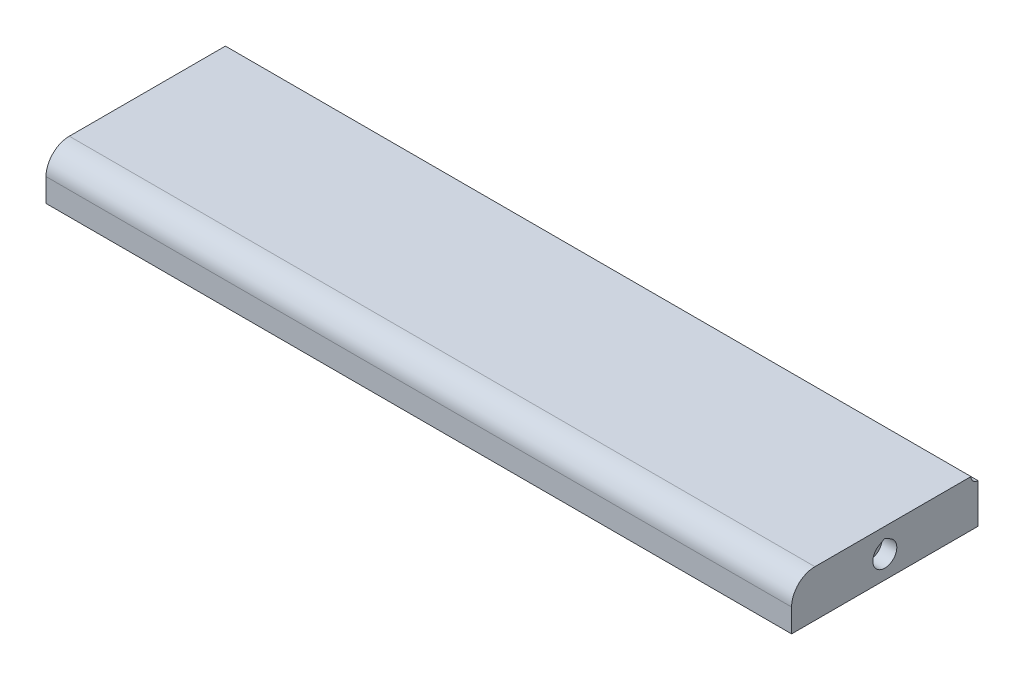
ISO-10303-21;
HEADER;
FILE_DESCRIPTION(('STEP AP214'),'2;1');
FILE_NAME('part.step','',(''),(''),'','','');
FILE_SCHEMA(('AUTOMOTIVE_DESIGN { 1 0 10303 214 1 1 1 1 }'));
ENDSEC;
DATA;
#1=APPLICATION_CONTEXT('core data for automotive mechanical design processes');
#2=APPLICATION_PROTOCOL_DEFINITION('international standard','automotive_design',2000,#1);
#3=PRODUCT_CONTEXT('',#1,'mechanical');
#4=PRODUCT('Part','Part','',(#3));
#5=PRODUCT_RELATED_PRODUCT_CATEGORY('part','',(#4));
#6=PRODUCT_DEFINITION_FORMATION('','',#4);
#7=PRODUCT_DEFINITION_CONTEXT('part definition',#1,'design');
#8=PRODUCT_DEFINITION('design','',#6,#7);
#9=PRODUCT_DEFINITION_SHAPE('','',#8);
#10=(LENGTH_UNIT() NAMED_UNIT(*) SI_UNIT(.MILLI.,.METRE.));
#11=(NAMED_UNIT(*) PLANE_ANGLE_UNIT() SI_UNIT($,.RADIAN.));
#12=(NAMED_UNIT(*) SI_UNIT($,.STERADIAN.) SOLID_ANGLE_UNIT());
#13=UNCERTAINTY_MEASURE_WITH_UNIT(LENGTH_MEASURE(1.E-05),#10,'distance_accuracy_value','');
#14=(GEOMETRIC_REPRESENTATION_CONTEXT(3) GLOBAL_UNCERTAINTY_ASSIGNED_CONTEXT((#13)) GLOBAL_UNIT_ASSIGNED_CONTEXT((#10,
#11,#12)) REPRESENTATION_CONTEXT('',''));
#15=CARTESIAN_POINT('',(0.,0.,0.));
#16=DIRECTION('',(0.,0.,1.));
#17=DIRECTION('',(1.,0.,0.));
#18=AXIS2_PLACEMENT_3D('',#15,#16,#17);
#19=CARTESIAN_POINT('',(-80.,-10.,-20.));
#20=DIRECTION('',(0.,0.,-1.));
#21=DIRECTION('',(-1.,0.,0.));
#22=AXIS2_PLACEMENT_3D('',#19,#20,#21);
#23=PLANE('',#22);
#24=CARTESIAN_POINT('',(40.,-5.94917694316329,-20.));
#25=DIRECTION('',(0.,0.,-1.));
#26=DIRECTION('',(-1.,0.,0.));
#27=AXIS2_PLACEMENT_3D('',#24,#25,#26);
#28=CIRCLE('',#27,2.575);
#29=CARTESIAN_POINT('',(41.2875,-3.71916152841835,-20.));
#30=VERTEX_POINT('',#29);
#31=CARTESIAN_POINT('',(38.7125,-3.71916152841836,-20.));
#32=VERTEX_POINT('',#31);
#33=EDGE_CURVE('E224',#30,#32,#28,.T.);
#34=ORIENTED_EDGE('',*,*,#33,.F.);
#35=DIRECTION('',(-0.866025403784442,0.499999999999995,0.));
#36=VECTOR('',#35,1.);
#37=CARTESIAN_POINT('',(8.71143081780576,15.0886407830611,-20.));
#38=LINE('',#37,#36);
#39=CARTESIAN_POINT('',(40.,-2.97582305683672,-20.));
#40=VERTEX_POINT('',#39);
#41=EDGE_CURVE('E219',#30,#40,#38,.T.);
#42=ORIENTED_EDGE('',*,*,#41,.T.);
#43=DIRECTION('',(-0.866025403784441,-0.499999999999995,0.));
#44=VECTOR('',#43,1.);
#45=CARTESIAN_POINT('',(11.2885691821938,-19.5523753683162,-20.));
#46=LINE('',#45,#44);
#47=EDGE_CURVE('E226',#40,#32,#46,.T.);
#48=ORIENTED_EDGE('',*,*,#47,.T.);
#49=EDGE_LOOP('',(#34,#42,#48));
#50=FACE_BOUND('',#49,.T.);
#51=DIRECTION('',(-1.,0.,0.));
#52=VECTOR('',#51,1.);
#53=CARTESIAN_POINT('',(81.,-1.5,-20.));
#54=LINE('',#53,#52);
#55=CARTESIAN_POINT('',(80.,-1.5,-20.));
#56=VERTEX_POINT('',#55);
#57=CARTESIAN_POINT('',(-80.,-1.5,-20.));
#58=VERTEX_POINT('',#57);
#59=EDGE_CURVE('E266',#56,#58,#54,.T.);
#60=ORIENTED_EDGE('',*,*,#59,.F.);
#61=DIRECTION('',(0.,1.,0.));
#62=VECTOR('',#61,1.);
#63=CARTESIAN_POINT('',(80.,-10.,-20.));
#64=LINE('',#63,#62);
#65=CARTESIAN_POINT('',(80.,-10.,-20.));
#66=VERTEX_POINT('',#65);
#67=EDGE_CURVE('E290',#66,#56,#64,.T.);
#68=ORIENTED_EDGE('',*,*,#67,.F.);
#69=DIRECTION('',(-1.,0.,0.));
#70=VECTOR('',#69,1.);
#71=CARTESIAN_POINT('',(-80.,-10.,-20.));
#72=LINE('',#71,#70);
#73=CARTESIAN_POINT('',(-80.,-10.,-20.));
#74=VERTEX_POINT('',#73);
#75=EDGE_CURVE('E279',#66,#74,#72,.T.);
#76=ORIENTED_EDGE('',*,*,#75,.T.);
#77=DIRECTION('',(0.,1.,0.));
#78=VECTOR('',#77,1.);
#79=CARTESIAN_POINT('',(-80.,-10.,-20.));
#80=LINE('',#79,#78);
#81=EDGE_CURVE('E286',#74,#58,#80,.T.);
#82=ORIENTED_EDGE('',*,*,#81,.T.);
#83=EDGE_LOOP('',(#60,#68,#76,#82));
#84=FACE_BOUND('',#83,.T.);
#85=DIRECTION('',(0.86602540378444,0.499999999999998,0.));
#86=VECTOR('',#85,1.);
#87=CARTESIAN_POINT('',(-8.7114308178059,15.0886407830612,-20.));
#88=LINE('',#87,#86);
#89=CARTESIAN_POINT('',(-41.2875,-3.71916152841834,-20.));
#90=VERTEX_POINT('',#89);
#91=CARTESIAN_POINT('',(-40.,-2.97582305683671,-20.));
#92=VERTEX_POINT('',#91);
#93=EDGE_CURVE('E251',#90,#92,#88,.T.);
#94=ORIENTED_EDGE('',*,*,#93,.F.);
#95=CARTESIAN_POINT('',(-40.,-5.94917694316328,-20.));
#96=DIRECTION('',(0.,0.,-1.));
#97=DIRECTION('',(-1.,0.,0.));
#98=AXIS2_PLACEMENT_3D('',#95,#96,#97);
#99=CIRCLE('',#98,2.575);
#100=CARTESIAN_POINT('',(-38.7125,-3.71916152841834,-20.));
#101=VERTEX_POINT('',#100);
#102=EDGE_CURVE('E211',#90,#101,#99,.F.);
#103=ORIENTED_EDGE('',*,*,#102,.T.);
#104=DIRECTION('',(0.86602540378444,-0.499999999999997,0.));
#105=VECTOR('',#104,1.);
#106=CARTESIAN_POINT('',(-11.2885691821939,-19.5523753683162,-20.));
#107=LINE('',#106,#105);
#108=EDGE_CURVE('E242',#92,#101,#107,.T.);
#109=ORIENTED_EDGE('',*,*,#108,.F.);
#110=EDGE_LOOP('',(#94,#103,#109));
#111=FACE_BOUND('',#110,.T.);
#112=ADVANCED_FACE('F39',(#50,#84,#111),#23,.T.);
#113=CARTESIAN_POINT('',(-80.,-10.,20.));
#114=DIRECTION('',(-1.,0.,0.));
#115=DIRECTION('',(0.,0.,1.));
#116=AXIS2_PLACEMENT_3D('',#113,#114,#115);
#117=PLANE('',#116);
#118=CARTESIAN_POINT('',(-80.,-5.19917694316328,0.));
#119=DIRECTION('',(-1.,0.,0.));
#120=DIRECTION('',(0.,0.,1.));
#121=AXIS2_PLACEMENT_3D('',#118,#119,#120);
#122=CIRCLE('',#121,2.575);
#123=CARTESIAN_POINT('',(-80.,-2.96916152841835,-1.28749999999999));
#124=VERTEX_POINT('',#123);
#125=CARTESIAN_POINT('',(-80.,-2.96916152841835,1.28749999999999));
#126=VERTEX_POINT('',#125);
#127=EDGE_CURVE('E62',#124,#126,#122,.T.);
#128=ORIENTED_EDGE('',*,*,#127,.F.);
#129=DIRECTION('',(0.,-0.499999999999997,-0.866025403784441));
#130=VECTOR('',#129,1.);
#131=CARTESIAN_POINT('',(-80.,-1.66936729262754,0.963809655774861));
#132=LINE('',#131,#130);
#133=CARTESIAN_POINT('',(-80.,-2.22582305683672,0.));
#134=VERTEX_POINT('',#133);
#135=EDGE_CURVE('E197',#134,#124,#132,.T.);
#136=ORIENTED_EDGE('',*,*,#135,.F.);
#137=DIRECTION('',(0.,-0.499999999999997,0.866025403784441));
#138=VECTOR('',#137,1.);
#139=CARTESIAN_POINT('',(-80.,-1.66936729262755,-0.963809655774863));
#140=LINE('',#139,#138);
#141=EDGE_CURVE('E204',#134,#126,#140,.T.);
#142=ORIENTED_EDGE('',*,*,#141,.T.);
#143=EDGE_LOOP('',(#128,#136,#142));
#144=FACE_BOUND('',#143,.T.);
#145=DIRECTION('',(0.,1.,0.));
#146=VECTOR('',#145,1.);
#147=CARTESIAN_POINT('',(-80.,-10.,20.));
#148=LINE('',#147,#146);
#149=CARTESIAN_POINT('',(-80.,-10.,20.));
#150=VERTEX_POINT('',#149);
#151=CARTESIAN_POINT('',(-80.,-5.,20.));
#152=VERTEX_POINT('',#151);
#153=EDGE_CURVE('E282',#150,#152,#148,.T.);
#154=ORIENTED_EDGE('',*,*,#153,.T.);
#155=CARTESIAN_POINT('',(-80.,-5.,15.));
#156=DIRECTION('',(-1.,0.,0.));
#157=DIRECTION('',(0.,0.,1.));
#158=AXIS2_PLACEMENT_3D('',#155,#156,#157);
#159=CIRCLE('',#158,5.);
#160=CARTESIAN_POINT('',(-80.,0.,15.));
#161=VERTEX_POINT('',#160);
#162=EDGE_CURVE('E11',#152,#161,#159,.T.);
#163=ORIENTED_EDGE('',*,*,#162,.T.);
#164=DIRECTION('',(0.,0.,1.));
#165=VECTOR('',#164,1.);
#166=CARTESIAN_POINT('',(-80.,0.,20.));
#167=LINE('',#166,#165);
#168=CARTESIAN_POINT('',(-80.,0.,-18.5));
#169=VERTEX_POINT('',#168);
#170=EDGE_CURVE('E268',#169,#161,#167,.T.);
#171=ORIENTED_EDGE('',*,*,#170,.F.);
#172=CARTESIAN_POINT('',(-80.,0.,-20.));
#173=DIRECTION('',(-1.,0.,0.));
#174=DIRECTION('',(0.,0.,1.));
#175=AXIS2_PLACEMENT_3D('',#172,#173,#174);
#176=CIRCLE('',#175,1.5);
#177=EDGE_CURVE('E263',#169,#58,#176,.F.);
#178=ORIENTED_EDGE('',*,*,#177,.T.);
#179=ORIENTED_EDGE('',*,*,#81,.F.);
#180=DIRECTION('',(0.,0.,1.));
#181=VECTOR('',#180,1.);
#182=CARTESIAN_POINT('',(-80.,-10.,20.));
#183=LINE('',#182,#181);
#184=EDGE_CURVE('E269',#74,#150,#183,.T.);
#185=ORIENTED_EDGE('',*,*,#184,.T.);
#186=EDGE_LOOP('',(#154,#163,#171,#178,#179,#185));
#187=FACE_BOUND('',#186,.T.);
#188=ADVANCED_FACE('F311',(#144,#187),#117,.T.);
#189=CARTESIAN_POINT('',(80.,-10.,20.));
#190=DIRECTION('',(1.,0.,0.));
#191=DIRECTION('',(0.,0.,-1.));
#192=AXIS2_PLACEMENT_3D('',#189,#190,#191);
#193=PLANE('',#192);
#194=CARTESIAN_POINT('',(80.,-5.19917694316328,0.));
#195=DIRECTION('',(1.,0.,0.));
#196=DIRECTION('',(0.,0.,-1.));
#197=AXIS2_PLACEMENT_3D('',#194,#195,#196);
#198=CIRCLE('',#197,2.575);
#199=CARTESIAN_POINT('',(80.,-2.96916152841835,1.28749999999999));
#200=VERTEX_POINT('',#199);
#201=CARTESIAN_POINT('',(80.,-2.96916152841835,-1.28749999999999));
#202=VERTEX_POINT('',#201);
#203=EDGE_CURVE('E54',#200,#202,#198,.T.);
#204=ORIENTED_EDGE('',*,*,#203,.F.);
#205=DIRECTION('',(0.,-0.499999999999997,0.866025403784441));
#206=VECTOR('',#205,1.);
#207=CARTESIAN_POINT('',(80.,-1.66936729262754,-0.963809655774861));
#208=LINE('',#207,#206);
#209=CARTESIAN_POINT('',(80.,-2.22582305683672,0.));
#210=VERTEX_POINT('',#209);
#211=EDGE_CURVE('E181',#210,#200,#208,.T.);
#212=ORIENTED_EDGE('',*,*,#211,.F.);
#213=DIRECTION('',(0.,-0.499999999999997,-0.866025403784441));
#214=VECTOR('',#213,1.);
#215=CARTESIAN_POINT('',(80.,-1.66936729262755,0.963809655774863));
#216=LINE('',#215,#214);
#217=EDGE_CURVE('E184',#210,#202,#216,.T.);
#218=ORIENTED_EDGE('',*,*,#217,.T.);
#219=EDGE_LOOP('',(#204,#212,#218));
#220=FACE_BOUND('',#219,.T.);
#221=DIRECTION('',(0.,0.,-1.));
#222=VECTOR('',#221,1.);
#223=CARTESIAN_POINT('',(80.,0.,20.));
#224=LINE('',#223,#222);
#225=CARTESIAN_POINT('',(80.,0.,15.));
#226=VERTEX_POINT('',#225);
#227=CARTESIAN_POINT('',(80.,0.,-18.5));
#228=VERTEX_POINT('',#227);
#229=EDGE_CURVE('E273',#226,#228,#224,.T.);
#230=ORIENTED_EDGE('',*,*,#229,.F.);
#231=CARTESIAN_POINT('',(80.,-5.,15.));
#232=DIRECTION('',(1.,0.,0.));
#233=DIRECTION('',(0.,0.,-1.));
#234=AXIS2_PLACEMENT_3D('',#231,#232,#233);
#235=CIRCLE('',#234,5.);
#236=CARTESIAN_POINT('',(80.,-5.,20.));
#237=VERTEX_POINT('',#236);
#238=EDGE_CURVE('E303',#226,#237,#235,.T.);
#239=ORIENTED_EDGE('',*,*,#238,.T.);
#240=DIRECTION('',(0.,1.,0.));
#241=VECTOR('',#240,1.);
#242=CARTESIAN_POINT('',(80.,-10.,20.));
#243=LINE('',#242,#241);
#244=CARTESIAN_POINT('',(80.,-10.,20.));
#245=VERTEX_POINT('',#244);
#246=EDGE_CURVE('E293',#245,#237,#243,.T.);
#247=ORIENTED_EDGE('',*,*,#246,.F.);
#248=DIRECTION('',(0.,0.,-1.));
#249=VECTOR('',#248,1.);
#250=CARTESIAN_POINT('',(80.,-10.,20.));
#251=LINE('',#250,#249);
#252=EDGE_CURVE('E276',#245,#66,#251,.T.);
#253=ORIENTED_EDGE('',*,*,#252,.T.);
#254=ORIENTED_EDGE('',*,*,#67,.T.);
#255=CARTESIAN_POINT('',(80.,0.,-20.));
#256=DIRECTION('',(1.,0.,0.));
#257=DIRECTION('',(0.,0.,-1.));
#258=AXIS2_PLACEMENT_3D('',#255,#256,#257);
#259=CIRCLE('',#258,1.5);
#260=EDGE_CURVE('E234',#56,#228,#259,.F.);
#261=ORIENTED_EDGE('',*,*,#260,.T.);
#262=EDGE_LOOP('',(#230,#239,#247,#253,#254,#261));
#263=FACE_BOUND('',#262,.T.);
#264=ADVANCED_FACE('F320',(#220,#263),#193,.T.);
#265=CARTESIAN_POINT('',(-80.,-10.,20.));
#266=DIRECTION('',(0.,0.,1.));
#267=DIRECTION('',(1.,0.,0.));
#268=AXIS2_PLACEMENT_3D('',#265,#266,#267);
#269=PLANE('',#268);
#270=ORIENTED_EDGE('',*,*,#246,.T.);
#271=DIRECTION('',(1.,0.,0.));
#272=VECTOR('',#271,1.);
#273=CARTESIAN_POINT('',(-80.,-5.,20.));
#274=LINE('',#273,#272);
#275=EDGE_CURVE('E47',#237,#152,#274,.F.);
#276=ORIENTED_EDGE('',*,*,#275,.T.);
#277=ORIENTED_EDGE('',*,*,#153,.F.);
#278=DIRECTION('',(1.,0.,0.));
#279=VECTOR('',#278,1.);
#280=CARTESIAN_POINT('',(-80.,-10.,20.));
#281=LINE('',#280,#279);
#282=EDGE_CURVE('E272',#150,#245,#281,.T.);
#283=ORIENTED_EDGE('',*,*,#282,.T.);
#284=EDGE_LOOP('',(#270,#276,#277,#283));
#285=FACE_BOUND('',#284,.T.);
#286=ADVANCED_FACE('F306',(#285),#269,.T.);
#287=CARTESIAN_POINT('',(0.,-10.,0.));
#288=DIRECTION('',(0.,-1.,0.));
#289=DIRECTION('',(0.,0.,-1.));
#290=AXIS2_PLACEMENT_3D('',#287,#288,#289);
#291=PLANE('',#290);
#292=ORIENTED_EDGE('',*,*,#184,.F.);
#293=ORIENTED_EDGE('',*,*,#75,.F.);
#294=ORIENTED_EDGE('',*,*,#252,.F.);
#295=ORIENTED_EDGE('',*,*,#282,.F.);
#296=EDGE_LOOP('',(#292,#293,#294,#295));
#297=FACE_BOUND('',#296,.T.);
#298=ADVANCED_FACE('F328',(#297),#291,.T.);
#299=CARTESIAN_POINT('',(0.,0.,0.));
#300=DIRECTION('',(0.,-1.,0.));
#301=DIRECTION('',(0.,0.,-1.));
#302=AXIS2_PLACEMENT_3D('',#299,#300,#301);
#303=PLANE('',#302);
#304=ORIENTED_EDGE('',*,*,#170,.T.);
#305=DIRECTION('',(1.,0.,0.));
#306=VECTOR('',#305,1.);
#307=CARTESIAN_POINT('',(80.,0.,15.));
#308=LINE('',#307,#306);
#309=EDGE_CURVE('E300',#161,#226,#308,.T.);
#310=ORIENTED_EDGE('',*,*,#309,.T.);
#311=ORIENTED_EDGE('',*,*,#229,.T.);
#312=DIRECTION('',(-1.,0.,0.));
#313=VECTOR('',#312,1.);
#314=CARTESIAN_POINT('',(81.,0.,-18.5));
#315=LINE('',#314,#313);
#316=EDGE_CURVE('E289',#228,#169,#315,.T.);
#317=ORIENTED_EDGE('',*,*,#316,.T.);
#318=EDGE_LOOP('',(#304,#310,#311,#317));
#319=FACE_BOUND('',#318,.T.);
#320=ADVANCED_FACE('F317',(#319),#303,.F.);
#321=CARTESIAN_POINT('',(81.,0.,-20.));
#322=DIRECTION('',(-1.,0.,0.));
#323=DIRECTION('',(0.,0.,1.));
#324=AXIS2_PLACEMENT_3D('',#321,#322,#323);
#325=CYLINDRICAL_SURFACE('',#324,1.5);
#326=ORIENTED_EDGE('',*,*,#59,.T.);
#327=ORIENTED_EDGE('',*,*,#177,.F.);
#328=ORIENTED_EDGE('',*,*,#316,.F.);
#329=ORIENTED_EDGE('',*,*,#260,.F.);
#330=EDGE_LOOP('',(#326,#327,#328,#329));
#331=FACE_BOUND('',#330,.T.);
#332=ADVANCED_FACE('F323',(#331),#325,.F.);
#333=CARTESIAN_POINT('',(-40.,-5.94917694316328,-16.85));
#334=DIRECTION('',(0.,0.,-1.));
#335=DIRECTION('',(-1.,0.,0.));
#336=AXIS2_PLACEMENT_3D('',#333,#334,#335);
#337=CYLINDRICAL_SURFACE('',#336,2.575);
#338=ORIENTED_EDGE('',*,*,#102,.F.);
#339=DIRECTION('',(0.,0.,-1.));
#340=VECTOR('',#339,1.);
#341=CARTESIAN_POINT('',(-41.2875,-3.71916152841834,-16.85));
#342=LINE('',#341,#340);
#343=CARTESIAN_POINT('',(-41.2875,-3.71916152841834,-16.85));
#344=VERTEX_POINT('',#343);
#345=EDGE_CURVE('E248',#344,#90,#342,.T.);
#346=ORIENTED_EDGE('',*,*,#345,.F.);
#347=CARTESIAN_POINT('',(-40.,-5.94917694316328,-16.85));
#348=DIRECTION('',(0.,0.,-1.));
#349=DIRECTION('',(-1.,0.,0.));
#350=AXIS2_PLACEMENT_3D('',#347,#348,#349);
#351=CIRCLE('',#350,2.575);
#352=CARTESIAN_POINT('',(-38.7125,-3.71916152841834,-16.85));
#353=VERTEX_POINT('',#352);
#354=EDGE_CURVE('E239',#344,#353,#351,.F.);
#355=ORIENTED_EDGE('',*,*,#354,.T.);
#356=DIRECTION('',(0.,0.,-1.));
#357=VECTOR('',#356,1.);
#358=CARTESIAN_POINT('',(-38.7125,-3.71916152841834,-16.85));
#359=LINE('',#358,#357);
#360=EDGE_CURVE('E227',#353,#101,#359,.T.);
#361=ORIENTED_EDGE('',*,*,#360,.T.);
#362=EDGE_LOOP('',(#338,#346,#355,#361));
#363=FACE_BOUND('',#362,.T.);
#364=ADVANCED_FACE('F404',(#363),#337,.F.);
#365=CARTESIAN_POINT('',(-11.2885691821939,-19.5523753683162,-16.85));
#366=DIRECTION('',(0.499999999999997,0.86602540378444,0.));
#367=DIRECTION('',(-0.86602540378444,0.499999999999997,0.));
#368=AXIS2_PLACEMENT_3D('',#365,#366,#367);
#369=PLANE('',#368);
#370=ORIENTED_EDGE('',*,*,#108,.T.);
#371=ORIENTED_EDGE('',*,*,#360,.F.);
#372=DIRECTION('',(0.86602540378444,-0.499999999999997,0.));
#373=VECTOR('',#372,1.);
#374=CARTESIAN_POINT('',(-11.2885691821939,-19.5523753683162,-16.85));
#375=LINE('',#374,#373);
#376=CARTESIAN_POINT('',(-40.,-2.97582305683671,-16.85));
#377=VERTEX_POINT('',#376);
#378=EDGE_CURVE('E245',#377,#353,#375,.T.);
#379=ORIENTED_EDGE('',*,*,#378,.F.);
#380=DIRECTION('',(0.,0.,-1.));
#381=VECTOR('',#380,1.);
#382=CARTESIAN_POINT('',(-40.,-2.97582305683671,-16.85));
#383=LINE('',#382,#381);
#384=EDGE_CURVE('E257',#377,#92,#383,.T.);
#385=ORIENTED_EDGE('',*,*,#384,.T.);
#386=EDGE_LOOP('',(#370,#371,#379,#385));
#387=FACE_BOUND('',#386,.T.);
#388=ADVANCED_FACE('F401',(#387),#369,.F.);
#389=CARTESIAN_POINT('',(-8.7114308178059,15.0886407830612,-16.85));
#390=DIRECTION('',(-0.499999999999998,0.86602540378444,0.));
#391=DIRECTION('',(-0.86602540378444,-0.499999999999998,0.));
#392=AXIS2_PLACEMENT_3D('',#389,#390,#391);
#393=PLANE('',#392);
#394=ORIENTED_EDGE('',*,*,#93,.T.);
#395=ORIENTED_EDGE('',*,*,#384,.F.);
#396=DIRECTION('',(0.86602540378444,0.499999999999998,0.));
#397=VECTOR('',#396,1.);
#398=CARTESIAN_POINT('',(-8.7114308178059,15.0886407830612,-16.85));
#399=LINE('',#398,#397);
#400=EDGE_CURVE('E241',#344,#377,#399,.T.);
#401=ORIENTED_EDGE('',*,*,#400,.F.);
#402=ORIENTED_EDGE('',*,*,#345,.T.);
#403=EDGE_LOOP('',(#394,#395,#401,#402));
#404=FACE_BOUND('',#403,.T.);
#405=ADVANCED_FACE('F399',(#404),#393,.F.);
#406=CARTESIAN_POINT('',(0.,0.,-16.85));
#407=DIRECTION('',(0.,0.,-1.));
#408=DIRECTION('',(-1.,0.,0.));
#409=AXIS2_PLACEMENT_3D('',#406,#407,#408);
#410=PLANE('',#409);
#411=ORIENTED_EDGE('',*,*,#354,.F.);
#412=ORIENTED_EDGE('',*,*,#400,.T.);
#413=ORIENTED_EDGE('',*,*,#378,.T.);
#414=EDGE_LOOP('',(#411,#412,#413));
#415=FACE_BOUND('',#414,.T.);
#416=ADVANCED_FACE('F395',(#415),#410,.T.);
#417=CARTESIAN_POINT('',(40.,-5.94917694316329,-16.85));
#418=DIRECTION('',(0.,0.,-1.));
#419=DIRECTION('',(-1.,0.,0.));
#420=AXIS2_PLACEMENT_3D('',#417,#418,#419);
#421=CYLINDRICAL_SURFACE('',#420,2.575);
#422=ORIENTED_EDGE('',*,*,#33,.T.);
#423=DIRECTION('',(0.,0.,-1.));
#424=VECTOR('',#423,1.);
#425=CARTESIAN_POINT('',(38.7125,-3.71916152841835,-16.85));
#426=LINE('',#425,#424);
#427=CARTESIAN_POINT('',(38.7125,-3.71916152841835,-16.85));
#428=VERTEX_POINT('',#427);
#429=EDGE_CURVE('E223',#428,#32,#426,.T.);
#430=ORIENTED_EDGE('',*,*,#429,.F.);
#431=CARTESIAN_POINT('',(40.,-5.94917694316329,-16.85));
#432=DIRECTION('',(0.,0.,-1.));
#433=DIRECTION('',(-1.,0.,0.));
#434=AXIS2_PLACEMENT_3D('',#431,#432,#433);
#435=CIRCLE('',#434,2.575);
#436=CARTESIAN_POINT('',(41.2875,-3.71916152841835,-16.85));
#437=VERTEX_POINT('',#436);
#438=EDGE_CURVE('E215',#437,#428,#435,.T.);
#439=ORIENTED_EDGE('',*,*,#438,.F.);
#440=DIRECTION('',(0.,0.,-1.));
#441=VECTOR('',#440,1.);
#442=CARTESIAN_POINT('',(41.2875,-3.71916152841835,-16.85));
#443=LINE('',#442,#441);
#444=EDGE_CURVE('E232',#437,#30,#443,.T.);
#445=ORIENTED_EDGE('',*,*,#444,.T.);
#446=EDGE_LOOP('',(#422,#430,#439,#445));
#447=FACE_BOUND('',#446,.T.);
#448=ADVANCED_FACE('F388',(#447),#421,.F.);
#449=CARTESIAN_POINT('',(8.71143081780576,15.0886407830611,-16.85));
#450=DIRECTION('',(-0.499999999999995,-0.866025403784442,0.));
#451=DIRECTION('',(0.866025403784442,-0.499999999999995,0.));
#452=AXIS2_PLACEMENT_3D('',#449,#450,#451);
#453=PLANE('',#452);
#454=ORIENTED_EDGE('',*,*,#41,.F.);
#455=ORIENTED_EDGE('',*,*,#444,.F.);
#456=DIRECTION('',(-0.866025403784442,0.499999999999995,0.));
#457=VECTOR('',#456,1.);
#458=CARTESIAN_POINT('',(8.71143081780576,15.0886407830611,-16.85));
#459=LINE('',#458,#457);
#460=CARTESIAN_POINT('',(40.,-2.97582305683672,-16.85));
#461=VERTEX_POINT('',#460);
#462=EDGE_CURVE('E221',#437,#461,#459,.T.);
#463=ORIENTED_EDGE('',*,*,#462,.T.);
#464=DIRECTION('',(0.,0.,-1.));
#465=VECTOR('',#464,1.);
#466=CARTESIAN_POINT('',(40.,-2.97582305683672,-16.85));
#467=LINE('',#466,#465);
#468=EDGE_CURVE('E235',#461,#40,#467,.T.);
#469=ORIENTED_EDGE('',*,*,#468,.T.);
#470=EDGE_LOOP('',(#454,#455,#463,#469));
#471=FACE_BOUND('',#470,.T.);
#472=ADVANCED_FACE('F385',(#471),#453,.T.);
#473=CARTESIAN_POINT('',(11.2885691821938,-19.5523753683162,-16.85));
#474=DIRECTION('',(0.499999999999995,-0.866025403784441,0.));
#475=DIRECTION('',(0.866025403784441,0.499999999999995,0.));
#476=AXIS2_PLACEMENT_3D('',#473,#474,#475);
#477=PLANE('',#476);
#478=ORIENTED_EDGE('',*,*,#47,.F.);
#479=ORIENTED_EDGE('',*,*,#468,.F.);
#480=DIRECTION('',(-0.866025403784441,-0.499999999999995,0.));
#481=VECTOR('',#480,1.);
#482=CARTESIAN_POINT('',(11.2885691821938,-19.5523753683162,-16.85));
#483=LINE('',#482,#481);
#484=EDGE_CURVE('E218',#461,#428,#483,.T.);
#485=ORIENTED_EDGE('',*,*,#484,.T.);
#486=ORIENTED_EDGE('',*,*,#429,.T.);
#487=EDGE_LOOP('',(#478,#479,#485,#486));
#488=FACE_BOUND('',#487,.T.);
#489=ADVANCED_FACE('F383',(#488),#477,.T.);
#490=CARTESIAN_POINT('',(0.,0.,-16.85));
#491=DIRECTION('',(0.,0.,-1.));
#492=DIRECTION('',(-1.,0.,0.));
#493=AXIS2_PLACEMENT_3D('',#490,#491,#492);
#494=PLANE('',#493);
#495=ORIENTED_EDGE('',*,*,#438,.T.);
#496=ORIENTED_EDGE('',*,*,#484,.F.);
#497=ORIENTED_EDGE('',*,*,#462,.F.);
#498=EDGE_LOOP('',(#495,#496,#497));
#499=FACE_BOUND('',#498,.T.);
#500=ADVANCED_FACE('F380',(#499),#494,.T.);
#501=CARTESIAN_POINT('',(0.,-5.,15.));
#502=DIRECTION('',(-1.,0.,0.));
#503=DIRECTION('',(0.,0.,1.));
#504=AXIS2_PLACEMENT_3D('',#501,#502,#503);
#505=CYLINDRICAL_SURFACE('',#504,5.);
#506=ORIENTED_EDGE('',*,*,#162,.F.);
#507=ORIENTED_EDGE('',*,*,#275,.F.);
#508=ORIENTED_EDGE('',*,*,#238,.F.);
#509=ORIENTED_EDGE('',*,*,#309,.F.);
#510=EDGE_LOOP('',(#506,#507,#508,#509));
#511=FACE_BOUND('',#510,.T.);
#512=ADVANCED_FACE('F41',(#511),#505,.T.);
#513=CARTESIAN_POINT('',(-76.85,-5.19917694316328,0.));
#514=DIRECTION('',(-1.,0.,0.));
#515=DIRECTION('',(0.,0.,1.));
#516=AXIS2_PLACEMENT_3D('',#513,#514,#515);
#517=CYLINDRICAL_SURFACE('',#516,2.575);
#518=ORIENTED_EDGE('',*,*,#127,.T.);
#519=DIRECTION('',(-1.,0.,0.));
#520=VECTOR('',#519,1.);
#521=CARTESIAN_POINT('',(-76.85,-2.96916152841835,1.28749999999999));
#522=LINE('',#521,#520);
#523=CARTESIAN_POINT('',(-76.85,-2.96916152841835,1.28749999999999));
#524=VERTEX_POINT('',#523);
#525=EDGE_CURVE('E202',#524,#126,#522,.T.);
#526=ORIENTED_EDGE('',*,*,#525,.F.);
#527=CARTESIAN_POINT('',(-76.85,-5.19917694316328,0.));
#528=DIRECTION('',(-1.,0.,0.));
#529=DIRECTION('',(0.,0.,1.));
#530=AXIS2_PLACEMENT_3D('',#527,#528,#529);
#531=CIRCLE('',#530,2.575);
#532=CARTESIAN_POINT('',(-76.85,-2.96916152841835,-1.28749999999999));
#533=VERTEX_POINT('',#532);
#534=EDGE_CURVE('E193',#533,#524,#531,.T.);
#535=ORIENTED_EDGE('',*,*,#534,.F.);
#536=DIRECTION('',(-1.,0.,0.));
#537=VECTOR('',#536,1.);
#538=CARTESIAN_POINT('',(-76.85,-2.96916152841835,-1.28749999999999));
#539=LINE('',#538,#537);
#540=EDGE_CURVE('E209',#533,#124,#539,.T.);
#541=ORIENTED_EDGE('',*,*,#540,.T.);
#542=EDGE_LOOP('',(#518,#526,#535,#541));
#543=FACE_BOUND('',#542,.T.);
#544=ADVANCED_FACE('F373',(#543),#517,.F.);
#545=CARTESIAN_POINT('',(-76.85,-1.66936729262754,0.963809655774861));
#546=DIRECTION('',(0.,0.866025403784441,-0.499999999999997));
#547=DIRECTION('',(0.,0.499999999999997,0.866025403784441));
#548=AXIS2_PLACEMENT_3D('',#545,#546,#547);
#549=PLANE('',#548);
#550=ORIENTED_EDGE('',*,*,#135,.T.);
#551=ORIENTED_EDGE('',*,*,#540,.F.);
#552=DIRECTION('',(0.,-0.499999999999997,-0.866025403784441));
#553=VECTOR('',#552,1.);
#554=CARTESIAN_POINT('',(-76.85,-1.66936729262754,0.963809655774861));
#555=LINE('',#554,#553);
#556=CARTESIAN_POINT('',(-76.85,-2.22582305683672,0.));
#557=VERTEX_POINT('',#556);
#558=EDGE_CURVE('E199',#557,#533,#555,.T.);
#559=ORIENTED_EDGE('',*,*,#558,.F.);
#560=DIRECTION('',(-1.,0.,0.));
#561=VECTOR('',#560,1.);
#562=CARTESIAN_POINT('',(-76.85,-2.22582305683672,0.));
#563=LINE('',#562,#561);
#564=EDGE_CURVE('E212',#557,#134,#563,.T.);
#565=ORIENTED_EDGE('',*,*,#564,.T.);
#566=EDGE_LOOP('',(#550,#551,#559,#565));
#567=FACE_BOUND('',#566,.T.);
#568=ADVANCED_FACE('F370',(#567),#549,.F.);
#569=CARTESIAN_POINT('',(-76.85,-1.66936729262755,-0.963809655774863));
#570=DIRECTION('',(0.,-0.86602540378444,-0.499999999999997));
#571=DIRECTION('',(0.,0.499999999999997,-0.866025403784441));
#572=AXIS2_PLACEMENT_3D('',#569,#570,#571);
#573=PLANE('',#572);
#574=ORIENTED_EDGE('',*,*,#141,.F.);
#575=ORIENTED_EDGE('',*,*,#564,.F.);
#576=DIRECTION('',(0.,-0.499999999999997,0.866025403784441));
#577=VECTOR('',#576,1.);
#578=CARTESIAN_POINT('',(-76.85,-1.66936729262755,-0.963809655774863));
#579=LINE('',#578,#577);
#580=EDGE_CURVE('E196',#557,#524,#579,.T.);
#581=ORIENTED_EDGE('',*,*,#580,.T.);
#582=ORIENTED_EDGE('',*,*,#525,.T.);
#583=EDGE_LOOP('',(#574,#575,#581,#582));
#584=FACE_BOUND('',#583,.T.);
#585=ADVANCED_FACE('F368',(#584),#573,.T.);
#586=CARTESIAN_POINT('',(-76.85,0.,0.));
#587=DIRECTION('',(-1.,0.,0.));
#588=DIRECTION('',(0.,0.,1.));
#589=AXIS2_PLACEMENT_3D('',#586,#587,#588);
#590=PLANE('',#589);
#591=ORIENTED_EDGE('',*,*,#534,.T.);
#592=ORIENTED_EDGE('',*,*,#580,.F.);
#593=ORIENTED_EDGE('',*,*,#558,.T.);
#594=EDGE_LOOP('',(#591,#592,#593));
#595=FACE_BOUND('',#594,.T.);
#596=ADVANCED_FACE('F362',(#595),#590,.T.);
#597=CARTESIAN_POINT('',(76.85,-5.19917694316328,0.));
#598=DIRECTION('',(1.,0.,0.));
#599=DIRECTION('',(0.,0.,-1.));
#600=AXIS2_PLACEMENT_3D('',#597,#598,#599);
#601=CYLINDRICAL_SURFACE('',#600,2.575);
#602=ORIENTED_EDGE('',*,*,#203,.T.);
#603=DIRECTION('',(1.,0.,0.));
#604=VECTOR('',#603,1.);
#605=CARTESIAN_POINT('',(76.85,-2.96916152841835,-1.28749999999999));
#606=LINE('',#605,#604);
#607=CARTESIAN_POINT('',(76.85,-2.96916152841835,-1.28749999999999));
#608=VERTEX_POINT('',#607);
#609=EDGE_CURVE('E167',#608,#202,#606,.T.);
#610=ORIENTED_EDGE('',*,*,#609,.F.);
#611=CARTESIAN_POINT('',(76.85,-5.19917694316328,0.));
#612=DIRECTION('',(1.,0.,0.));
#613=DIRECTION('',(0.,0.,-1.));
#614=AXIS2_PLACEMENT_3D('',#611,#612,#613);
#615=CIRCLE('',#614,2.575);
#616=CARTESIAN_POINT('',(76.85,-2.96916152841835,1.28749999999999));
#617=VERTEX_POINT('',#616);
#618=EDGE_CURVE('E175',#617,#608,#615,.T.);
#619=ORIENTED_EDGE('',*,*,#618,.F.);
#620=DIRECTION('',(1.,0.,0.));
#621=VECTOR('',#620,1.);
#622=CARTESIAN_POINT('',(76.85,-2.96916152841835,1.28749999999999));
#623=LINE('',#622,#621);
#624=EDGE_CURVE('E190',#617,#200,#623,.T.);
#625=ORIENTED_EDGE('',*,*,#624,.T.);
#626=EDGE_LOOP('',(#602,#610,#619,#625));
#627=FACE_BOUND('',#626,.T.);
#628=ADVANCED_FACE('F178',(#627),#601,.F.);
#629=CARTESIAN_POINT('',(76.85,-1.66936729262754,-0.963809655774861));
#630=DIRECTION('',(0.,0.866025403784441,0.499999999999997));
#631=DIRECTION('',(0.,-0.499999999999997,0.866025403784441));
#632=AXIS2_PLACEMENT_3D('',#629,#630,#631);
#633=PLANE('',#632);
#634=ORIENTED_EDGE('',*,*,#211,.T.);
#635=ORIENTED_EDGE('',*,*,#624,.F.);
#636=DIRECTION('',(0.,-0.499999999999997,0.866025403784441));
#637=VECTOR('',#636,1.);
#638=CARTESIAN_POINT('',(76.85,-1.66936729262754,-0.963809655774861));
#639=LINE('',#638,#637);
#640=CARTESIAN_POINT('',(76.85,-2.22582305683672,0.));
#641=VERTEX_POINT('',#640);
#642=EDGE_CURVE('E174',#641,#617,#639,.T.);
#643=ORIENTED_EDGE('',*,*,#642,.F.);
#644=DIRECTION('',(1.,0.,0.));
#645=VECTOR('',#644,1.);
#646=CARTESIAN_POINT('',(76.85,-2.22582305683672,0.));
#647=LINE('',#646,#645);
#648=EDGE_CURVE('E169',#641,#210,#647,.T.);
#649=ORIENTED_EDGE('',*,*,#648,.T.);
#650=EDGE_LOOP('',(#634,#635,#643,#649));
#651=FACE_BOUND('',#650,.T.);
#652=ADVANCED_FACE('F354',(#651),#633,.F.);
#653=CARTESIAN_POINT('',(76.85,-1.66936729262755,0.963809655774863));
#654=DIRECTION('',(0.,-0.86602540378444,0.499999999999997));
#655=DIRECTION('',(0.,-0.499999999999997,-0.866025403784441));
#656=AXIS2_PLACEMENT_3D('',#653,#654,#655);
#657=PLANE('',#656);
#658=ORIENTED_EDGE('',*,*,#217,.F.);
#659=ORIENTED_EDGE('',*,*,#648,.F.);
#660=DIRECTION('',(0.,-0.499999999999997,-0.866025403784441));
#661=VECTOR('',#660,1.);
#662=CARTESIAN_POINT('',(76.85,-1.66936729262755,0.963809655774863));
#663=LINE('',#662,#661);
#664=EDGE_CURVE('E164',#641,#608,#663,.T.);
#665=ORIENTED_EDGE('',*,*,#664,.T.);
#666=ORIENTED_EDGE('',*,*,#609,.T.);
#667=EDGE_LOOP('',(#658,#659,#665,#666));
#668=FACE_BOUND('',#667,.T.);
#669=ADVANCED_FACE('F166',(#668),#657,.T.);
#670=CARTESIAN_POINT('',(76.85,0.,0.));
#671=DIRECTION('',(1.,0.,0.));
#672=DIRECTION('',(0.,0.,-1.));
#673=AXIS2_PLACEMENT_3D('',#670,#671,#672);
#674=PLANE('',#673);
#675=ORIENTED_EDGE('',*,*,#618,.T.);
#676=ORIENTED_EDGE('',*,*,#664,.F.);
#677=ORIENTED_EDGE('',*,*,#642,.T.);
#678=EDGE_LOOP('',(#675,#676,#677));
#679=FACE_BOUND('',#678,.T.);
#680=ADVANCED_FACE('F180',(#679),#674,.T.);
#681=CLOSED_SHELL('',(#112,#188,#264,#286,#298,#320,#332,#364,#388,#405,#416,#448,#472,#489,
#500,#512,#544,#568,#585,#596,#628,#652,#669,#680));
#682=MANIFOLD_SOLID_BREP('B2',#681);
#683=ADVANCED_BREP_SHAPE_REPRESENTATION('',(#18,#682),#14);
#684=SHAPE_DEFINITION_REPRESENTATION(#9,#683);
ENDSEC;
END-ISO-10303-21;
